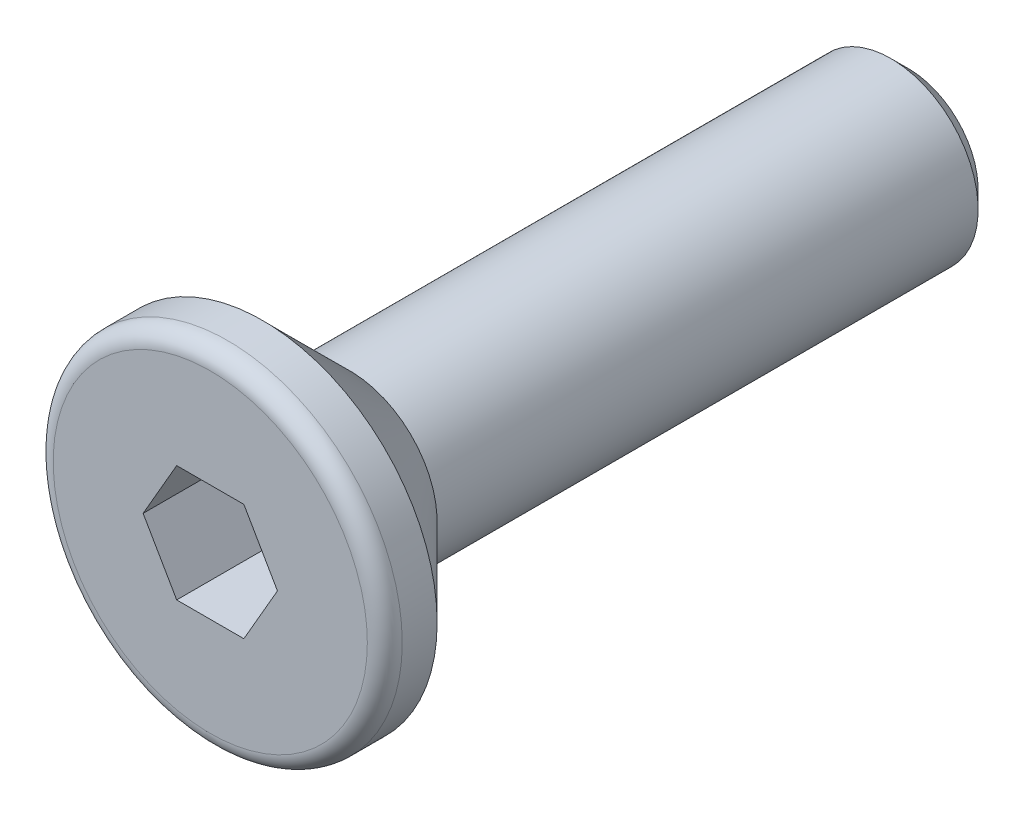
ISO-10303-21;
HEADER;
FILE_DESCRIPTION(('STEP AP214'),'2;1');
FILE_NAME('part.step','',(''),(''),'','','');
FILE_SCHEMA(('AUTOMOTIVE_DESIGN { 1 0 10303 214 1 1 1 1 }'));
ENDSEC;
DATA;
#1=APPLICATION_CONTEXT('core data for automotive mechanical design processes');
#2=APPLICATION_PROTOCOL_DEFINITION('international standard','automotive_design',2000,#1);
#3=PRODUCT_CONTEXT('',#1,'mechanical');
#4=PRODUCT('Part','Part','',(#3));
#5=PRODUCT_RELATED_PRODUCT_CATEGORY('part','',(#4));
#6=PRODUCT_DEFINITION_FORMATION('','',#4);
#7=PRODUCT_DEFINITION_CONTEXT('part definition',#1,'design');
#8=PRODUCT_DEFINITION('design','',#6,#7);
#9=PRODUCT_DEFINITION_SHAPE('','',#8);
#10=(LENGTH_UNIT() NAMED_UNIT(*) SI_UNIT(.MILLI.,.METRE.));
#11=(NAMED_UNIT(*) PLANE_ANGLE_UNIT() SI_UNIT($,.RADIAN.));
#12=(NAMED_UNIT(*) SI_UNIT($,.STERADIAN.) SOLID_ANGLE_UNIT());
#13=UNCERTAINTY_MEASURE_WITH_UNIT(LENGTH_MEASURE(1.E-05),#10,'distance_accuracy_value','');
#14=(GEOMETRIC_REPRESENTATION_CONTEXT(3) GLOBAL_UNCERTAINTY_ASSIGNED_CONTEXT((#13)) GLOBAL_UNIT_ASSIGNED_CONTEXT((#10,
#11,#12)) REPRESENTATION_CONTEXT('',''));
#15=CARTESIAN_POINT('',(0.,0.,0.));
#16=DIRECTION('',(0.,0.,1.));
#17=DIRECTION('',(1.,0.,0.));
#18=AXIS2_PLACEMENT_3D('',#15,#16,#17);
#19=CARTESIAN_POINT('',(0.,0.,6.));
#20=DIRECTION('',(0.,0.,1.));
#21=DIRECTION('',(1.,0.,0.));
#22=AXIS2_PLACEMENT_3D('',#19,#20,#21);
#23=PLANE('',#22);
#24=CARTESIAN_POINT('',(0.,0.,6.));
#25=DIRECTION('',(0.,0.,1.));
#26=DIRECTION('',(1.,0.,0.));
#27=AXIS2_PLACEMENT_3D('',#24,#25,#26);
#28=CIRCLE('',#27,2.7);
#29=CARTESIAN_POINT('',(2.7,0.,6.));
#30=VERTEX_POINT('',#29);
#31=EDGE_CURVE('E11',#30,#30,#28,.T.);
#32=ORIENTED_EDGE('',*,*,#31,.T.);
#33=EDGE_LOOP('',(#32));
#34=FACE_BOUND('',#33,.T.);
#35=DIRECTION('',(0.5,0.866025403784439,0.));
#36=VECTOR('',#35,1.);
#37=CARTESIAN_POINT('',(0.577350269189626,-1.,6.));
#38=LINE('',#37,#36);
#39=CARTESIAN_POINT('',(0.577350269189626,-1.,6.));
#40=VERTEX_POINT('',#39);
#41=CARTESIAN_POINT('',(1.15470053837925,0.,6.));
#42=VERTEX_POINT('',#41);
#43=EDGE_CURVE('E50',#40,#42,#38,.T.);
#44=ORIENTED_EDGE('',*,*,#43,.F.);
#45=DIRECTION('',(1.,0.,0.));
#46=VECTOR('',#45,1.);
#47=CARTESIAN_POINT('',(-0.577350269189626,-1.,6.));
#48=LINE('',#47,#46);
#49=CARTESIAN_POINT('',(-0.577350269189626,-1.,6.));
#50=VERTEX_POINT('',#49);
#51=EDGE_CURVE('E133',#50,#40,#48,.T.);
#52=ORIENTED_EDGE('',*,*,#51,.F.);
#53=DIRECTION('',(0.5,-0.866025403784438,0.));
#54=VECTOR('',#53,1.);
#55=CARTESIAN_POINT('',(-1.15470053837925,0.,6.));
#56=LINE('',#55,#54);
#57=CARTESIAN_POINT('',(-1.15470053837925,0.,6.));
#58=VERTEX_POINT('',#57);
#59=EDGE_CURVE('E131',#58,#50,#56,.T.);
#60=ORIENTED_EDGE('',*,*,#59,.F.);
#61=DIRECTION('',(-0.5,-0.866025403784439,0.));
#62=VECTOR('',#61,1.);
#63=CARTESIAN_POINT('',(-0.577350269189626,1.,6.));
#64=LINE('',#63,#62);
#65=CARTESIAN_POINT('',(-0.577350269189626,1.,6.));
#66=VERTEX_POINT('',#65);
#67=EDGE_CURVE('E98',#66,#58,#64,.T.);
#68=ORIENTED_EDGE('',*,*,#67,.F.);
#69=DIRECTION('',(-1.,0.,0.));
#70=VECTOR('',#69,1.);
#71=CARTESIAN_POINT('',(0.577350269189626,1.,6.));
#72=LINE('',#71,#70);
#73=CARTESIAN_POINT('',(0.577350269189626,1.,6.));
#74=VERTEX_POINT('',#73);
#75=EDGE_CURVE('E127',#74,#66,#72,.T.);
#76=ORIENTED_EDGE('',*,*,#75,.F.);
#77=DIRECTION('',(-0.5,0.866025403784438,0.));
#78=VECTOR('',#77,1.);
#79=CARTESIAN_POINT('',(1.15470053837925,0.,6.));
#80=LINE('',#79,#78);
#81=EDGE_CURVE('E124',#42,#74,#80,.T.);
#82=ORIENTED_EDGE('',*,*,#81,.F.);
#83=EDGE_LOOP('',(#44,#52,#60,#68,#76,#82));
#84=FACE_BOUND('',#83,.T.);
#85=ADVANCED_FACE('F35',(#34,#84),#23,.T.);
#86=CARTESIAN_POINT('',(0.,0.,-6.));
#87=DIRECTION('',(0.,0.,-1.));
#88=DIRECTION('',(-1.,0.,0.));
#89=AXIS2_PLACEMENT_3D('',#86,#87,#88);
#90=CYLINDRICAL_SURFACE('',#89,3.);
#91=CARTESIAN_POINT('',(0.,0.,5.7));
#92=DIRECTION('',(0.,0.,1.));
#93=DIRECTION('',(1.,0.,0.));
#94=AXIS2_PLACEMENT_3D('',#91,#92,#93);
#95=CIRCLE('',#94,3.);
#96=CARTESIAN_POINT('',(3.,0.,5.7));
#97=VERTEX_POINT('',#96);
#98=EDGE_CURVE('E43',#97,#97,#95,.F.);
#99=ORIENTED_EDGE('',*,*,#98,.T.);
#100=EDGE_LOOP('',(#99));
#101=FACE_BOUND('',#100,.T.);
#102=CARTESIAN_POINT('',(0.,0.,5.10000000000002));
#103=DIRECTION('',(0.,0.,-1.));
#104=DIRECTION('',(-1.,0.,0.));
#105=AXIS2_PLACEMENT_3D('',#102,#103,#104);
#106=CIRCLE('',#105,3.);
#107=CARTESIAN_POINT('',(-3.,0.,5.10000000000002));
#108=VERTEX_POINT('',#107);
#109=EDGE_CURVE('E151',#108,#108,#106,.T.);
#110=ORIENTED_EDGE('',*,*,#109,.F.);
#111=EDGE_LOOP('',(#110));
#112=FACE_BOUND('',#111,.T.);
#113=ADVANCED_FACE('F156',(#101,#112),#90,.T.);
#114=CARTESIAN_POINT('',(0.,0.,3.6));
#115=DIRECTION('',(0.,0.,1.));
#116=DIRECTION('',(1.,0.,0.));
#117=AXIS2_PLACEMENT_3D('',#114,#115,#116);
#118=CONICAL_SURFACE('',#117,1.5,0.785398163397443);
#119=ORIENTED_EDGE('',*,*,#109,.T.);
#120=EDGE_LOOP('',(#119));
#121=FACE_BOUND('',#120,.T.);
#122=CARTESIAN_POINT('',(0.,0.,3.6));
#123=DIRECTION('',(0.,0.,-1.));
#124=DIRECTION('',(-1.,0.,0.));
#125=AXIS2_PLACEMENT_3D('',#122,#123,#124);
#126=CIRCLE('',#125,1.5);
#127=CARTESIAN_POINT('',(-1.5,0.,3.6));
#128=VERTEX_POINT('',#127);
#129=EDGE_CURVE('E148',#128,#128,#126,.T.);
#130=ORIENTED_EDGE('',*,*,#129,.F.);
#131=EDGE_LOOP('',(#130));
#132=FACE_BOUND('',#131,.T.);
#133=ADVANCED_FACE('F172',(#121,#132),#118,.T.);
#134=CARTESIAN_POINT('',(0.,0.,-6.));
#135=DIRECTION('',(0.,0.,-1.));
#136=DIRECTION('',(-1.,0.,0.));
#137=AXIS2_PLACEMENT_3D('',#134,#135,#136);
#138=CYLINDRICAL_SURFACE('',#137,1.5);
#139=ORIENTED_EDGE('',*,*,#129,.T.);
#140=EDGE_LOOP('',(#139));
#141=FACE_BOUND('',#140,.T.);
#142=CARTESIAN_POINT('',(0.,0.,-5.7));
#143=DIRECTION('',(0.,0.,-1.));
#144=DIRECTION('',(-1.,0.,0.));
#145=AXIS2_PLACEMENT_3D('',#142,#143,#144);
#146=CIRCLE('',#145,1.5);
#147=CARTESIAN_POINT('',(-1.5,0.,-5.7));
#148=VERTEX_POINT('',#147);
#149=EDGE_CURVE('E145',#148,#148,#146,.T.);
#150=ORIENTED_EDGE('',*,*,#149,.F.);
#151=EDGE_LOOP('',(#150));
#152=FACE_BOUND('',#151,.T.);
#153=ADVANCED_FACE('F178',(#141,#152),#138,.T.);
#154=CARTESIAN_POINT('',(0.,0.,-6.));
#155=DIRECTION('',(0.,0.,1.));
#156=DIRECTION('',(1.,0.,0.));
#157=AXIS2_PLACEMENT_3D('',#154,#155,#156);
#158=CONICAL_SURFACE('',#157,1.2,0.785398163397443);
#159=ORIENTED_EDGE('',*,*,#149,.T.);
#160=EDGE_LOOP('',(#159));
#161=FACE_BOUND('',#160,.T.);
#162=CARTESIAN_POINT('',(0.,0.,-6.));
#163=DIRECTION('',(0.,0.,-1.));
#164=DIRECTION('',(-1.,0.,0.));
#165=AXIS2_PLACEMENT_3D('',#162,#163,#164);
#166=CIRCLE('',#165,1.2);
#167=CARTESIAN_POINT('',(-1.2,0.,-6.));
#168=VERTEX_POINT('',#167);
#169=EDGE_CURVE('E137',#168,#168,#166,.T.);
#170=ORIENTED_EDGE('',*,*,#169,.F.);
#171=EDGE_LOOP('',(#170));
#172=FACE_BOUND('',#171,.T.);
#173=ADVANCED_FACE('F182',(#161,#172),#158,.T.);
#174=CARTESIAN_POINT('',(0.,1.2,-6.));
#175=DIRECTION('',(0.,0.,-1.));
#176=DIRECTION('',(-1.,0.,0.));
#177=AXIS2_PLACEMENT_3D('',#174,#175,#176);
#178=PLANE('',#177);
#179=ORIENTED_EDGE('',*,*,#169,.T.);
#180=EDGE_LOOP('',(#179));
#181=FACE_BOUND('',#180,.T.);
#182=ADVANCED_FACE('F186',(#181),#178,.T.);
#183=CARTESIAN_POINT('',(0.577350269189626,-1.,4.5));
#184=DIRECTION('',(0.866025403784438,-0.5,0.));
#185=DIRECTION('',(0.5,0.866025403784439,0.));
#186=AXIS2_PLACEMENT_3D('',#183,#184,#185);
#187=PLANE('',#186);
#188=ORIENTED_EDGE('',*,*,#43,.T.);
#189=DIRECTION('',(0.,0.,1.));
#190=VECTOR('',#189,1.);
#191=CARTESIAN_POINT('',(1.15470053837925,0.,4.5));
#192=LINE('',#191,#190);
#193=CARTESIAN_POINT('',(1.15470053837925,0.,4.5));
#194=VERTEX_POINT('',#193);
#195=EDGE_CURVE('E80',#194,#42,#192,.T.);
#196=ORIENTED_EDGE('',*,*,#195,.F.);
#197=DIRECTION('',(0.5,0.866025403784439,0.));
#198=VECTOR('',#197,1.);
#199=CARTESIAN_POINT('',(0.577350269189626,-1.,4.5));
#200=LINE('',#199,#198);
#201=CARTESIAN_POINT('',(0.577350269189626,-1.,4.5));
#202=VERTEX_POINT('',#201);
#203=EDGE_CURVE('E135',#202,#194,#200,.T.);
#204=ORIENTED_EDGE('',*,*,#203,.F.);
#205=DIRECTION('',(0.,0.,1.));
#206=VECTOR('',#205,1.);
#207=CARTESIAN_POINT('',(0.577350269189626,-1.,4.5));
#208=LINE('',#207,#206);
#209=EDGE_CURVE('E58',#202,#40,#208,.T.);
#210=ORIENTED_EDGE('',*,*,#209,.T.);
#211=EDGE_LOOP('',(#188,#196,#204,#210));
#212=FACE_BOUND('',#211,.T.);
#213=ADVANCED_FACE('F190',(#212),#187,.F.);
#214=CARTESIAN_POINT('',(-0.577350269189626,-1.,4.5));
#215=DIRECTION('',(0.,-1.,0.));
#216=DIRECTION('',(1.,0.,0.));
#217=AXIS2_PLACEMENT_3D('',#214,#215,#216);
#218=PLANE('',#217);
#219=ORIENTED_EDGE('',*,*,#51,.T.);
#220=ORIENTED_EDGE('',*,*,#209,.F.);
#221=DIRECTION('',(1.,0.,0.));
#222=VECTOR('',#221,1.);
#223=CARTESIAN_POINT('',(-0.577350269189626,-1.,4.5));
#224=LINE('',#223,#222);
#225=CARTESIAN_POINT('',(-0.577350269189626,-1.,4.5));
#226=VERTEX_POINT('',#225);
#227=EDGE_CURVE('E110',#226,#202,#224,.T.);
#228=ORIENTED_EDGE('',*,*,#227,.F.);
#229=DIRECTION('',(0.,0.,1.));
#230=VECTOR('',#229,1.);
#231=CARTESIAN_POINT('',(-0.577350269189626,-1.,4.5));
#232=LINE('',#231,#230);
#233=EDGE_CURVE('E102',#226,#50,#232,.T.);
#234=ORIENTED_EDGE('',*,*,#233,.T.);
#235=EDGE_LOOP('',(#219,#220,#228,#234));
#236=FACE_BOUND('',#235,.T.);
#237=ADVANCED_FACE('F194',(#236),#218,.F.);
#238=CARTESIAN_POINT('',(-1.15470053837925,0.,4.5));
#239=DIRECTION('',(-0.866025403784439,-0.5,0.));
#240=DIRECTION('',(0.5,-0.866025403784439,0.));
#241=AXIS2_PLACEMENT_3D('',#238,#239,#240);
#242=PLANE('',#241);
#243=ORIENTED_EDGE('',*,*,#59,.T.);
#244=ORIENTED_EDGE('',*,*,#233,.F.);
#245=DIRECTION('',(0.5,-0.866025403784438,0.));
#246=VECTOR('',#245,1.);
#247=CARTESIAN_POINT('',(-1.15470053837925,0.,4.5));
#248=LINE('',#247,#246);
#249=CARTESIAN_POINT('',(-1.15470053837925,0.,4.5));
#250=VERTEX_POINT('',#249);
#251=EDGE_CURVE('E106',#250,#226,#248,.T.);
#252=ORIENTED_EDGE('',*,*,#251,.F.);
#253=DIRECTION('',(0.,0.,1.));
#254=VECTOR('',#253,1.);
#255=CARTESIAN_POINT('',(-1.15470053837925,0.,4.5));
#256=LINE('',#255,#254);
#257=EDGE_CURVE('E91',#250,#58,#256,.T.);
#258=ORIENTED_EDGE('',*,*,#257,.T.);
#259=EDGE_LOOP('',(#243,#244,#252,#258));
#260=FACE_BOUND('',#259,.T.);
#261=ADVANCED_FACE('F107',(#260),#242,.F.);
#262=CARTESIAN_POINT('',(-0.577350269189626,1.,4.5));
#263=DIRECTION('',(-0.866025403784439,0.5,0.));
#264=DIRECTION('',(-0.5,-0.866025403784439,0.));
#265=AXIS2_PLACEMENT_3D('',#262,#263,#264);
#266=PLANE('',#265);
#267=ORIENTED_EDGE('',*,*,#67,.T.);
#268=ORIENTED_EDGE('',*,*,#257,.F.);
#269=DIRECTION('',(-0.5,-0.866025403784439,0.));
#270=VECTOR('',#269,1.);
#271=CARTESIAN_POINT('',(-0.577350269189626,1.,4.5));
#272=LINE('',#271,#270);
#273=CARTESIAN_POINT('',(-0.577350269189626,1.,4.5));
#274=VERTEX_POINT('',#273);
#275=EDGE_CURVE('E95',#274,#250,#272,.T.);
#276=ORIENTED_EDGE('',*,*,#275,.F.);
#277=DIRECTION('',(0.,0.,1.));
#278=VECTOR('',#277,1.);
#279=CARTESIAN_POINT('',(-0.577350269189626,1.,4.5));
#280=LINE('',#279,#278);
#281=EDGE_CURVE('E103',#274,#66,#280,.T.);
#282=ORIENTED_EDGE('',*,*,#281,.T.);
#283=EDGE_LOOP('',(#267,#268,#276,#282));
#284=FACE_BOUND('',#283,.T.);
#285=ADVANCED_FACE('F93',(#284),#266,.F.);
#286=CARTESIAN_POINT('',(0.577350269189626,1.,4.5));
#287=DIRECTION('',(0.,1.,0.));
#288=DIRECTION('',(-1.,0.,0.));
#289=AXIS2_PLACEMENT_3D('',#286,#287,#288);
#290=PLANE('',#289);
#291=ORIENTED_EDGE('',*,*,#75,.T.);
#292=ORIENTED_EDGE('',*,*,#281,.F.);
#293=DIRECTION('',(-1.,0.,0.));
#294=VECTOR('',#293,1.);
#295=CARTESIAN_POINT('',(0.577350269189626,1.,4.5));
#296=LINE('',#295,#294);
#297=CARTESIAN_POINT('',(0.577350269189626,1.,4.5));
#298=VERTEX_POINT('',#297);
#299=EDGE_CURVE('E116',#298,#274,#296,.T.);
#300=ORIENTED_EDGE('',*,*,#299,.F.);
#301=DIRECTION('',(0.,0.,1.));
#302=VECTOR('',#301,1.);
#303=CARTESIAN_POINT('',(0.577350269189626,1.,4.5));
#304=LINE('',#303,#302);
#305=EDGE_CURVE('E140',#298,#74,#304,.T.);
#306=ORIENTED_EDGE('',*,*,#305,.T.);
#307=EDGE_LOOP('',(#291,#292,#300,#306));
#308=FACE_BOUND('',#307,.T.);
#309=ADVANCED_FACE('F197',(#308),#290,.F.);
#310=CARTESIAN_POINT('',(1.15470053837925,0.,4.5));
#311=DIRECTION('',(0.866025403784439,0.5,0.));
#312=DIRECTION('',(-0.5,0.866025403784439,0.));
#313=AXIS2_PLACEMENT_3D('',#310,#311,#312);
#314=PLANE('',#313);
#315=ORIENTED_EDGE('',*,*,#81,.T.);
#316=ORIENTED_EDGE('',*,*,#305,.F.);
#317=DIRECTION('',(-0.5,0.866025403784438,0.));
#318=VECTOR('',#317,1.);
#319=CARTESIAN_POINT('',(1.15470053837925,0.,4.5));
#320=LINE('',#319,#318);
#321=EDGE_CURVE('E118',#194,#298,#320,.T.);
#322=ORIENTED_EDGE('',*,*,#321,.F.);
#323=ORIENTED_EDGE('',*,*,#195,.T.);
#324=EDGE_LOOP('',(#315,#316,#322,#323));
#325=FACE_BOUND('',#324,.T.);
#326=ADVANCED_FACE('F164',(#325),#314,.F.);
#327=CARTESIAN_POINT('',(0.,0.,4.5));
#328=DIRECTION('',(0.,0.,1.));
#329=DIRECTION('',(1.,0.,0.));
#330=AXIS2_PLACEMENT_3D('',#327,#328,#329);
#331=PLANE('',#330);
#332=ORIENTED_EDGE('',*,*,#203,.T.);
#333=ORIENTED_EDGE('',*,*,#321,.T.);
#334=ORIENTED_EDGE('',*,*,#299,.T.);
#335=ORIENTED_EDGE('',*,*,#275,.T.);
#336=ORIENTED_EDGE('',*,*,#251,.T.);
#337=ORIENTED_EDGE('',*,*,#227,.T.);
#338=EDGE_LOOP('',(#332,#333,#334,#335,#336,#337));
#339=FACE_BOUND('',#338,.T.);
#340=ADVANCED_FACE('F113',(#339),#331,.T.);
#341=CARTESIAN_POINT('',(0.,0.,5.7));
#342=DIRECTION('',(0.,0.,1.));
#343=DIRECTION('',(1.,0.,0.));
#344=AXIS2_PLACEMENT_3D('',#341,#342,#343);
#345=TOROIDAL_SURFACE('',#344,2.7,0.3);
#346=ORIENTED_EDGE('',*,*,#31,.F.);
#347=EDGE_LOOP('',(#346));
#348=FACE_BOUND('',#347,.T.);
#349=ORIENTED_EDGE('',*,*,#98,.F.);
#350=EDGE_LOOP('',(#349));
#351=FACE_BOUND('',#350,.T.);
#352=ADVANCED_FACE('F37',(#348,#351),#345,.T.);
#353=CLOSED_SHELL('',(#85,#113,#133,#153,#173,#182,#213,#237,#261,#285,#309,#326,#340,#352));
#354=MANIFOLD_SOLID_BREP('B2',#353);
#355=ADVANCED_BREP_SHAPE_REPRESENTATION('',(#18,#354),#14);
#356=SHAPE_DEFINITION_REPRESENTATION(#9,#355);
ENDSEC;
END-ISO-10303-21;
